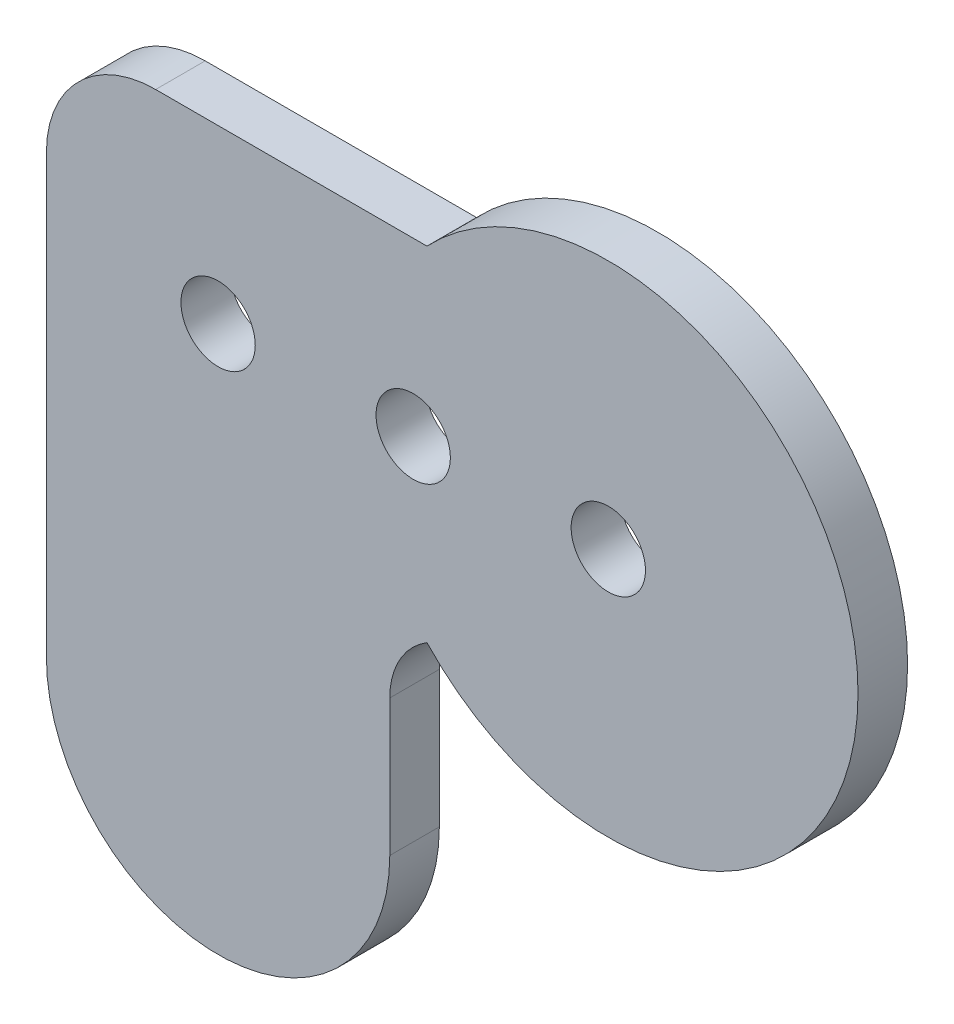
ISO-10303-21;
HEADER;
FILE_DESCRIPTION(('STEP AP214'),'2;1');
FILE_NAME('part.step','',(''),(''),'','','');
FILE_SCHEMA(('AUTOMOTIVE_DESIGN { 1 0 10303 214 1 1 1 1 }'));
ENDSEC;
DATA;
#1=APPLICATION_CONTEXT('core data for automotive mechanical design processes');
#2=APPLICATION_PROTOCOL_DEFINITION('international standard','automotive_design',2000,#1);
#3=PRODUCT_CONTEXT('',#1,'mechanical');
#4=PRODUCT('Part','Part','',(#3));
#5=PRODUCT_RELATED_PRODUCT_CATEGORY('part','',(#4));
#6=PRODUCT_DEFINITION_FORMATION('','',#4);
#7=PRODUCT_DEFINITION_CONTEXT('part definition',#1,'design');
#8=PRODUCT_DEFINITION('design','',#6,#7);
#9=PRODUCT_DEFINITION_SHAPE('','',#8);
#10=(LENGTH_UNIT() NAMED_UNIT(*) SI_UNIT(.MILLI.,.METRE.));
#11=(NAMED_UNIT(*) PLANE_ANGLE_UNIT() SI_UNIT($,.RADIAN.));
#12=(NAMED_UNIT(*) SI_UNIT($,.STERADIAN.) SOLID_ANGLE_UNIT());
#13=UNCERTAINTY_MEASURE_WITH_UNIT(LENGTH_MEASURE(1.E-05),#10,'distance_accuracy_value','');
#14=(GEOMETRIC_REPRESENTATION_CONTEXT(3) GLOBAL_UNCERTAINTY_ASSIGNED_CONTEXT((#13)) GLOBAL_UNIT_ASSIGNED_CONTEXT((#10,
#11,#12)) REPRESENTATION_CONTEXT('',''));
#15=CARTESIAN_POINT('',(0.,0.,0.));
#16=DIRECTION('',(0.,0.,1.));
#17=DIRECTION('',(1.,0.,0.));
#18=AXIS2_PLACEMENT_3D('',#15,#16,#17);
#19=CARTESIAN_POINT('',(0.,0.,3.175));
#20=DIRECTION('',(0.,0.,-1.));
#21=DIRECTION('',(-1.,0.,0.));
#22=AXIS2_PLACEMENT_3D('',#19,#20,#21);
#23=CYLINDRICAL_SURFACE('',#22,16.);
#24=CARTESIAN_POINT('',(0.,0.,0.));
#25=DIRECTION('',(0.,0.,1.));
#26=DIRECTION('',(1.,0.,0.));
#27=AXIS2_PLACEMENT_3D('',#24,#25,#26);
#28=CIRCLE('',#27,16.);
#29=CARTESIAN_POINT('',(-11.6189500386223,-11.,0.));
#30=VERTEX_POINT('',#29);
#31=CARTESIAN_POINT('',(-11.6189500386223,11.,0.));
#32=VERTEX_POINT('',#31);
#33=EDGE_CURVE('E115',#30,#32,#28,.T.);
#34=ORIENTED_EDGE('',*,*,#33,.T.);
#35=DIRECTION('',(0.,0.,-1.));
#36=VECTOR('',#35,1.);
#37=CARTESIAN_POINT('',(-11.6189500386223,11.,3.175));
#38=LINE('',#37,#36);
#39=CARTESIAN_POINT('',(-11.6189500386223,11.,3.175));
#40=VERTEX_POINT('',#39);
#41=EDGE_CURVE('E98',#40,#32,#38,.T.);
#42=ORIENTED_EDGE('',*,*,#41,.F.);
#43=CARTESIAN_POINT('',(0.,0.,3.175));
#44=DIRECTION('',(0.,0.,1.));
#45=DIRECTION('',(1.,0.,0.));
#46=AXIS2_PLACEMENT_3D('',#43,#44,#45);
#47=CIRCLE('',#46,16.);
#48=CARTESIAN_POINT('',(-11.6189500386223,-11.,3.175));
#49=VERTEX_POINT('',#48);
#50=EDGE_CURVE('E105',#49,#40,#47,.T.);
#51=ORIENTED_EDGE('',*,*,#50,.F.);
#52=DIRECTION('',(0.,0.,-1.));
#53=VECTOR('',#52,1.);
#54=CARTESIAN_POINT('',(-11.6189500386223,-11.,3.175));
#55=LINE('',#54,#53);
#56=EDGE_CURVE('E155',#49,#30,#55,.T.);
#57=ORIENTED_EDGE('',*,*,#56,.T.);
#58=EDGE_LOOP('',(#34,#42,#51,#57));
#59=FACE_BOUND('',#58,.T.);
#60=ADVANCED_FACE('F34',(#59),#23,.T.);
#61=CARTESIAN_POINT('',(-11.6189500386223,11.,3.175));
#62=DIRECTION('',(0.,-1.,0.));
#63=DIRECTION('',(1.,0.,0.));
#64=AXIS2_PLACEMENT_3D('',#61,#62,#63);
#65=PLANE('',#64);
#66=DIRECTION('',(-1.,0.,0.));
#67=VECTOR('',#66,1.);
#68=CARTESIAN_POINT('',(-11.6189500386223,11.,0.));
#69=LINE('',#68,#67);
#70=CARTESIAN_POINT('',(-29.,11.,0.));
#71=VERTEX_POINT('',#70);
#72=EDGE_CURVE('E143',#32,#71,#69,.T.);
#73=ORIENTED_EDGE('',*,*,#72,.T.);
#74=DIRECTION('',(0.,0.,-1.));
#75=VECTOR('',#74,1.);
#76=CARTESIAN_POINT('',(-29.,11.,3.175));
#77=LINE('',#76,#75);
#78=CARTESIAN_POINT('',(-29.,11.,3.175));
#79=VERTEX_POINT('',#78);
#80=EDGE_CURVE('E101',#71,#79,#77,.F.);
#81=ORIENTED_EDGE('',*,*,#80,.T.);
#82=DIRECTION('',(-1.,0.,0.));
#83=VECTOR('',#82,1.);
#84=CARTESIAN_POINT('',(-11.6189500386223,11.,3.175));
#85=LINE('',#84,#83);
#86=EDGE_CURVE('E93',#40,#79,#85,.T.);
#87=ORIENTED_EDGE('',*,*,#86,.F.);
#88=ORIENTED_EDGE('',*,*,#41,.T.);
#89=EDGE_LOOP('',(#73,#81,#87,#88));
#90=FACE_BOUND('',#89,.T.);
#91=ADVANCED_FACE('F96',(#90),#65,.F.);
#92=CARTESIAN_POINT('',(-36.,11.,3.175));
#93=DIRECTION('',(1.,0.,0.));
#94=DIRECTION('',(0.,1.,0.));
#95=AXIS2_PLACEMENT_3D('',#92,#93,#94);
#96=PLANE('',#95);
#97=DIRECTION('',(0.,-1.,0.));
#98=VECTOR('',#97,1.);
#99=CARTESIAN_POINT('',(-36.,11.,3.175));
#100=LINE('',#99,#98);
#101=CARTESIAN_POINT('',(-36.,3.99999999999999,3.175));
#102=VERTEX_POINT('',#101);
#103=CARTESIAN_POINT('',(-36.,-24.,3.175));
#104=VERTEX_POINT('',#103);
#105=EDGE_CURVE('E104',#102,#104,#100,.T.);
#106=ORIENTED_EDGE('',*,*,#105,.F.);
#107=DIRECTION('',(0.,0.,-1.));
#108=VECTOR('',#107,1.);
#109=CARTESIAN_POINT('',(-36.,3.99999999999999,3.175));
#110=LINE('',#109,#108);
#111=CARTESIAN_POINT('',(-36.,3.99999999999999,0.));
#112=VERTEX_POINT('',#111);
#113=EDGE_CURVE('E116',#102,#112,#110,.T.);
#114=ORIENTED_EDGE('',*,*,#113,.T.);
#115=DIRECTION('',(0.,-1.,0.));
#116=VECTOR('',#115,1.);
#117=CARTESIAN_POINT('',(-36.,11.,0.));
#118=LINE('',#117,#116);
#119=CARTESIAN_POINT('',(-36.,-24.,0.));
#120=VERTEX_POINT('',#119);
#121=EDGE_CURVE('E145',#112,#120,#118,.T.);
#122=ORIENTED_EDGE('',*,*,#121,.T.);
#123=DIRECTION('',(0.,0.,-1.));
#124=VECTOR('',#123,1.);
#125=CARTESIAN_POINT('',(-36.,-24.,3.175));
#126=LINE('',#125,#124);
#127=EDGE_CURVE('E117',#104,#120,#126,.T.);
#128=ORIENTED_EDGE('',*,*,#127,.F.);
#129=EDGE_LOOP('',(#106,#114,#122,#128));
#130=FACE_BOUND('',#129,.T.);
#131=ADVANCED_FACE('F136',(#130),#96,.F.);
#132=CARTESIAN_POINT('',(-25.,-24.,3.175));
#133=DIRECTION('',(0.,0.,-1.));
#134=DIRECTION('',(-1.,0.,0.));
#135=AXIS2_PLACEMENT_3D('',#132,#133,#134);
#136=CYLINDRICAL_SURFACE('',#135,11.);
#137=CARTESIAN_POINT('',(-25.,-24.,0.));
#138=DIRECTION('',(0.,0.,1.));
#139=DIRECTION('',(1.,0.,0.));
#140=AXIS2_PLACEMENT_3D('',#137,#138,#139);
#141=CIRCLE('',#140,11.);
#142=CARTESIAN_POINT('',(-14.,-24.,0.));
#143=VERTEX_POINT('',#142);
#144=EDGE_CURVE('E147',#120,#143,#141,.T.);
#145=ORIENTED_EDGE('',*,*,#144,.T.);
#146=DIRECTION('',(0.,0.,-1.));
#147=VECTOR('',#146,1.);
#148=CARTESIAN_POINT('',(-14.,-24.,3.175));
#149=LINE('',#148,#147);
#150=CARTESIAN_POINT('',(-14.,-24.,3.175));
#151=VERTEX_POINT('',#150);
#152=EDGE_CURVE('E123',#151,#143,#149,.T.);
#153=ORIENTED_EDGE('',*,*,#152,.F.);
#154=CARTESIAN_POINT('',(-25.,-24.,3.175));
#155=DIRECTION('',(0.,0.,1.));
#156=DIRECTION('',(1.,0.,0.));
#157=AXIS2_PLACEMENT_3D('',#154,#155,#156);
#158=CIRCLE('',#157,11.);
#159=EDGE_CURVE('E139',#104,#151,#158,.T.);
#160=ORIENTED_EDGE('',*,*,#159,.F.);
#161=ORIENTED_EDGE('',*,*,#127,.T.);
#162=EDGE_LOOP('',(#145,#153,#160,#161));
#163=FACE_BOUND('',#162,.T.);
#164=ADVANCED_FACE('F161',(#163),#136,.T.);
#165=CARTESIAN_POINT('',(-14.,-24.,3.175));
#166=DIRECTION('',(-1.,0.,0.));
#167=DIRECTION('',(0.,-1.,0.));
#168=AXIS2_PLACEMENT_3D('',#165,#166,#167);
#169=PLANE('',#168);
#170=DIRECTION('',(0.,1.,0.));
#171=VECTOR('',#170,1.);
#172=CARTESIAN_POINT('',(-14.,-24.,0.));
#173=LINE('',#172,#171);
#174=CARTESIAN_POINT('',(-14.,-15.2592371024868,0.));
#175=VERTEX_POINT('',#174);
#176=EDGE_CURVE('E113',#143,#175,#173,.T.);
#177=ORIENTED_EDGE('',*,*,#176,.T.);
#178=DIRECTION('',(0.,0.,-1.));
#179=VECTOR('',#178,1.);
#180=CARTESIAN_POINT('',(-14.,-15.2592371024868,3.175));
#181=LINE('',#180,#179);
#182=CARTESIAN_POINT('',(-14.,-15.2592371024868,3.175));
#183=VERTEX_POINT('',#182);
#184=EDGE_CURVE('E49',#175,#183,#181,.F.);
#185=ORIENTED_EDGE('',*,*,#184,.T.);
#186=DIRECTION('',(0.,1.,0.));
#187=VECTOR('',#186,1.);
#188=CARTESIAN_POINT('',(-14.,-24.,3.175));
#189=LINE('',#188,#187);
#190=EDGE_CURVE('E156',#151,#183,#189,.T.);
#191=ORIENTED_EDGE('',*,*,#190,.F.);
#192=ORIENTED_EDGE('',*,*,#152,.T.);
#193=EDGE_LOOP('',(#177,#185,#191,#192));
#194=FACE_BOUND('',#193,.T.);
#195=ADVANCED_FACE('F159',(#194),#169,.F.);
#196=CARTESIAN_POINT('',(0.,0.,3.175));
#197=DIRECTION('',(0.,0.,1.));
#198=DIRECTION('',(1.,0.,0.));
#199=AXIS2_PLACEMENT_3D('',#196,#197,#198);
#200=PLANE('',#199);
#201=CARTESIAN_POINT('',(-12.5,0.,3.175));
#202=DIRECTION('',(0.,0.,1.));
#203=DIRECTION('',(1.,0.,0.));
#204=AXIS2_PLACEMENT_3D('',#201,#202,#203);
#205=CIRCLE('',#204,2.38125);
#206=CARTESIAN_POINT('',(-10.11875,0.,3.175));
#207=VERTEX_POINT('',#206);
#208=EDGE_CURVE('E176',#207,#207,#205,.T.);
#209=ORIENTED_EDGE('',*,*,#208,.F.);
#210=EDGE_LOOP('',(#209));
#211=FACE_BOUND('',#210,.T.);
#212=CARTESIAN_POINT('',(-25.,0.,3.175));
#213=DIRECTION('',(0.,0.,1.));
#214=DIRECTION('',(1.,0.,0.));
#215=AXIS2_PLACEMENT_3D('',#212,#213,#214);
#216=CIRCLE('',#215,2.38125);
#217=CARTESIAN_POINT('',(-22.61875,0.,3.175));
#218=VERTEX_POINT('',#217);
#219=EDGE_CURVE('E170',#218,#218,#216,.T.);
#220=ORIENTED_EDGE('',*,*,#219,.F.);
#221=EDGE_LOOP('',(#220));
#222=FACE_BOUND('',#221,.T.);
#223=CARTESIAN_POINT('',(0.,0.,3.175));
#224=DIRECTION('',(0.,0.,1.));
#225=DIRECTION('',(1.,0.,0.));
#226=AXIS2_PLACEMENT_3D('',#223,#224,#225);
#227=CIRCLE('',#226,2.38125);
#228=CARTESIAN_POINT('',(2.38125,0.,3.175));
#229=VERTEX_POINT('',#228);
#230=EDGE_CURVE('E164',#229,#229,#227,.T.);
#231=ORIENTED_EDGE('',*,*,#230,.F.);
#232=EDGE_LOOP('',(#231));
#233=FACE_BOUND('',#232,.T.);
#234=ORIENTED_EDGE('',*,*,#86,.T.);
#235=CARTESIAN_POINT('',(-29.,3.99999999999999,3.175));
#236=DIRECTION('',(0.,0.,1.));
#237=DIRECTION('',(1.,0.,0.));
#238=AXIS2_PLACEMENT_3D('',#235,#236,#237);
#239=CIRCLE('',#238,7.);
#240=EDGE_CURVE('E129',#79,#102,#239,.T.);
#241=ORIENTED_EDGE('',*,*,#240,.T.);
#242=ORIENTED_EDGE('',*,*,#105,.T.);
#243=ORIENTED_EDGE('',*,*,#159,.T.);
#244=ORIENTED_EDGE('',*,*,#190,.T.);
#245=CARTESIAN_POINT('',(-9.00000000000001,-15.2592371024868,3.175));
#246=DIRECTION('',(0.,0.,1.));
#247=DIRECTION('',(1.,0.,0.));
#248=AXIS2_PLACEMENT_3D('',#245,#246,#247);
#249=CIRCLE('',#248,5.);
#250=EDGE_CURVE('E11',#183,#49,#249,.F.);
#251=ORIENTED_EDGE('',*,*,#250,.T.);
#252=ORIENTED_EDGE('',*,*,#50,.T.);
#253=EDGE_LOOP('',(#234,#241,#242,#243,#244,#251,#252));
#254=FACE_BOUND('',#253,.T.);
#255=ADVANCED_FACE('F108',(#211,#222,#233,#254),#200,.T.);
#256=CARTESIAN_POINT('',(0.,0.,0.));
#257=DIRECTION('',(0.,0.,1.));
#258=DIRECTION('',(1.,0.,0.));
#259=AXIS2_PLACEMENT_3D('',#256,#257,#258);
#260=PLANE('',#259);
#261=CARTESIAN_POINT('',(-12.5,0.,0.));
#262=DIRECTION('',(0.,0.,1.));
#263=DIRECTION('',(1.,0.,0.));
#264=AXIS2_PLACEMENT_3D('',#261,#262,#263);
#265=CIRCLE('',#264,2.38125);
#266=CARTESIAN_POINT('',(-10.11875,0.,0.));
#267=VERTEX_POINT('',#266);
#268=EDGE_CURVE('E167',#267,#267,#265,.T.);
#269=ORIENTED_EDGE('',*,*,#268,.T.);
#270=EDGE_LOOP('',(#269));
#271=FACE_BOUND('',#270,.T.);
#272=CARTESIAN_POINT('',(-25.,0.,0.));
#273=DIRECTION('',(0.,0.,1.));
#274=DIRECTION('',(1.,0.,0.));
#275=AXIS2_PLACEMENT_3D('',#272,#273,#274);
#276=CIRCLE('',#275,2.38125);
#277=CARTESIAN_POINT('',(-22.61875,0.,0.));
#278=VERTEX_POINT('',#277);
#279=EDGE_CURVE('E173',#278,#278,#276,.T.);
#280=ORIENTED_EDGE('',*,*,#279,.T.);
#281=EDGE_LOOP('',(#280));
#282=FACE_BOUND('',#281,.T.);
#283=CARTESIAN_POINT('',(0.,0.,0.));
#284=DIRECTION('',(0.,0.,1.));
#285=DIRECTION('',(1.,0.,0.));
#286=AXIS2_PLACEMENT_3D('',#283,#284,#285);
#287=CIRCLE('',#286,2.38125);
#288=CARTESIAN_POINT('',(2.38125,0.,0.));
#289=VERTEX_POINT('',#288);
#290=EDGE_CURVE('E149',#289,#289,#287,.T.);
#291=ORIENTED_EDGE('',*,*,#290,.T.);
#292=EDGE_LOOP('',(#291));
#293=FACE_BOUND('',#292,.T.);
#294=ORIENTED_EDGE('',*,*,#121,.F.);
#295=CARTESIAN_POINT('',(-29.,3.99999999999999,0.));
#296=DIRECTION('',(0.,0.,1.));
#297=DIRECTION('',(1.,0.,0.));
#298=AXIS2_PLACEMENT_3D('',#295,#296,#297);
#299=CIRCLE('',#298,7.);
#300=EDGE_CURVE('E120',#112,#71,#299,.F.);
#301=ORIENTED_EDGE('',*,*,#300,.T.);
#302=ORIENTED_EDGE('',*,*,#72,.F.);
#303=ORIENTED_EDGE('',*,*,#33,.F.);
#304=CARTESIAN_POINT('',(-9.00000000000001,-15.2592371024868,0.));
#305=DIRECTION('',(0.,0.,1.));
#306=DIRECTION('',(1.,0.,0.));
#307=AXIS2_PLACEMENT_3D('',#304,#305,#306);
#308=CIRCLE('',#307,5.);
#309=EDGE_CURVE('E42',#30,#175,#308,.T.);
#310=ORIENTED_EDGE('',*,*,#309,.T.);
#311=ORIENTED_EDGE('',*,*,#176,.F.);
#312=ORIENTED_EDGE('',*,*,#144,.F.);
#313=EDGE_LOOP('',(#294,#301,#302,#303,#310,#311,#312));
#314=FACE_BOUND('',#313,.T.);
#315=ADVANCED_FACE('F142',(#271,#282,#293,#314),#260,.F.);
#316=CARTESIAN_POINT('',(-29.,3.99999999999999,3.175));
#317=DIRECTION('',(0.,0.,-1.));
#318=DIRECTION('',(-1.,0.,0.));
#319=AXIS2_PLACEMENT_3D('',#316,#317,#318);
#320=CYLINDRICAL_SURFACE('',#319,7.);
#321=ORIENTED_EDGE('',*,*,#240,.F.);
#322=ORIENTED_EDGE('',*,*,#80,.F.);
#323=ORIENTED_EDGE('',*,*,#300,.F.);
#324=ORIENTED_EDGE('',*,*,#113,.F.);
#325=EDGE_LOOP('',(#321,#322,#323,#324));
#326=FACE_BOUND('',#325,.T.);
#327=ADVANCED_FACE('F141',(#326),#320,.T.);
#328=CARTESIAN_POINT('',(-9.00000000000001,-15.2592371024868,3.175));
#329=DIRECTION('',(0.,0.,-1.));
#330=DIRECTION('',(-1.,0.,0.));
#331=AXIS2_PLACEMENT_3D('',#328,#329,#330);
#332=CYLINDRICAL_SURFACE('',#331,5.);
#333=ORIENTED_EDGE('',*,*,#250,.F.);
#334=ORIENTED_EDGE('',*,*,#184,.F.);
#335=ORIENTED_EDGE('',*,*,#309,.F.);
#336=ORIENTED_EDGE('',*,*,#56,.F.);
#337=EDGE_LOOP('',(#333,#334,#335,#336));
#338=FACE_BOUND('',#337,.T.);
#339=ADVANCED_FACE('F36',(#338),#332,.F.);
#340=CARTESIAN_POINT('',(0.,0.,0.));
#341=DIRECTION('',(0.,0.,1.));
#342=DIRECTION('',(1.,0.,0.));
#343=AXIS2_PLACEMENT_3D('',#340,#341,#342);
#344=CYLINDRICAL_SURFACE('',#343,2.38125);
#345=ORIENTED_EDGE('',*,*,#290,.F.);
#346=EDGE_LOOP('',(#345));
#347=FACE_BOUND('',#346,.T.);
#348=ORIENTED_EDGE('',*,*,#230,.T.);
#349=EDGE_LOOP('',(#348));
#350=FACE_BOUND('',#349,.T.);
#351=ADVANCED_FACE('F198',(#347,#350),#344,.F.);
#352=CARTESIAN_POINT('',(-25.,0.,0.));
#353=DIRECTION('',(0.,0.,1.));
#354=DIRECTION('',(1.,0.,0.));
#355=AXIS2_PLACEMENT_3D('',#352,#353,#354);
#356=CYLINDRICAL_SURFACE('',#355,2.38125);
#357=ORIENTED_EDGE('',*,*,#279,.F.);
#358=EDGE_LOOP('',(#357));
#359=FACE_BOUND('',#358,.T.);
#360=ORIENTED_EDGE('',*,*,#219,.T.);
#361=EDGE_LOOP('',(#360));
#362=FACE_BOUND('',#361,.T.);
#363=ADVANCED_FACE('F187',(#359,#362),#356,.F.);
#364=CARTESIAN_POINT('',(-12.5,0.,0.));
#365=DIRECTION('',(0.,0.,1.));
#366=DIRECTION('',(1.,0.,0.));
#367=AXIS2_PLACEMENT_3D('',#364,#365,#366);
#368=CYLINDRICAL_SURFACE('',#367,2.38125);
#369=ORIENTED_EDGE('',*,*,#268,.F.);
#370=EDGE_LOOP('',(#369));
#371=FACE_BOUND('',#370,.T.);
#372=ORIENTED_EDGE('',*,*,#208,.T.);
#373=EDGE_LOOP('',(#372));
#374=FACE_BOUND('',#373,.T.);
#375=ADVANCED_FACE('F184',(#371,#374),#368,.F.);
#376=CLOSED_SHELL('',(#60,#91,#131,#164,#195,#255,#315,#327,#339,#351,#363,#375));
#377=MANIFOLD_SOLID_BREP('B2',#376);
#378=ADVANCED_BREP_SHAPE_REPRESENTATION('',(#18,#377),#14);
#379=SHAPE_DEFINITION_REPRESENTATION(#9,#378);
ENDSEC;
END-ISO-10303-21;
